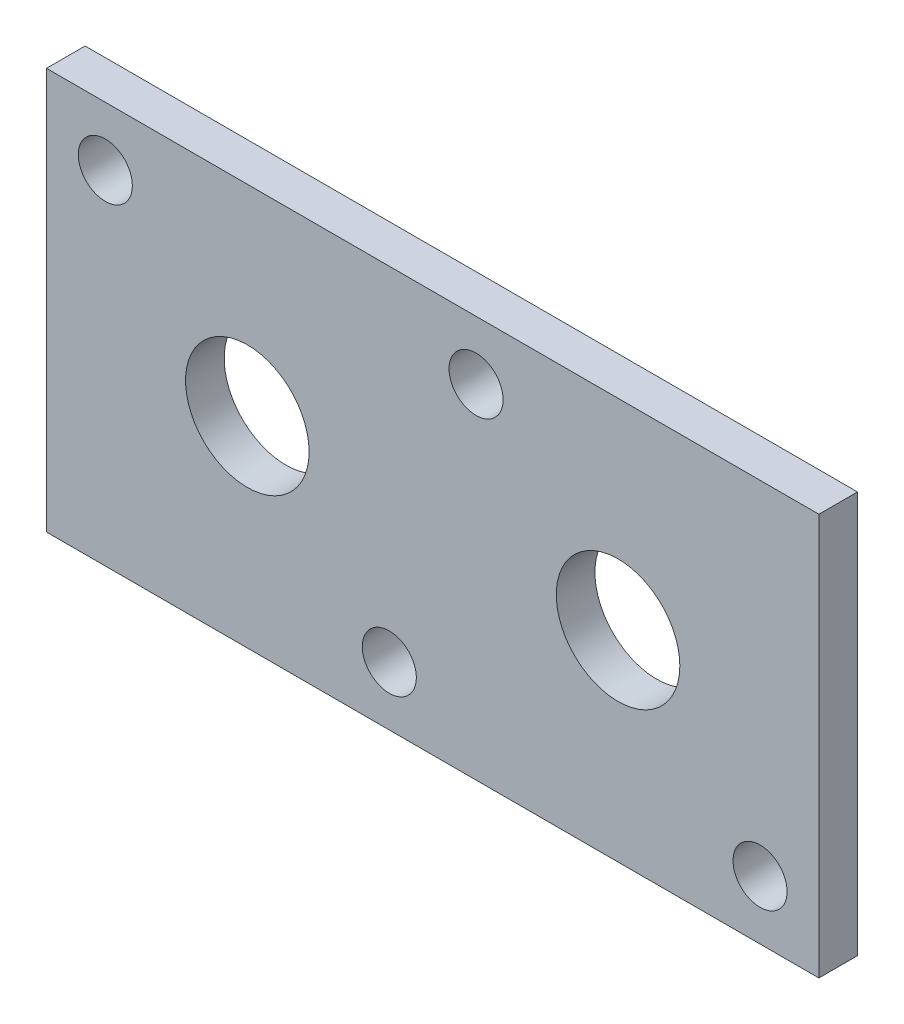
ISO-10303-21;
HEADER;
FILE_DESCRIPTION(('STEP AP214'),'2;1');
FILE_NAME('part.step','',(''),(''),'','','');
FILE_SCHEMA(('AUTOMOTIVE_DESIGN { 1 0 10303 214 1 1 1 1 }'));
ENDSEC;
DATA;
#1=APPLICATION_CONTEXT('core data for automotive mechanical design processes');
#2=APPLICATION_PROTOCOL_DEFINITION('international standard','automotive_design',2000,#1);
#3=PRODUCT_CONTEXT('',#1,'mechanical');
#4=PRODUCT('Part','Part','',(#3));
#5=PRODUCT_RELATED_PRODUCT_CATEGORY('part','',(#4));
#6=PRODUCT_DEFINITION_FORMATION('','',#4);
#7=PRODUCT_DEFINITION_CONTEXT('part definition',#1,'design');
#8=PRODUCT_DEFINITION('design','',#6,#7);
#9=PRODUCT_DEFINITION_SHAPE('','',#8);
#10=(LENGTH_UNIT() NAMED_UNIT(*) SI_UNIT(.MILLI.,.METRE.));
#11=(NAMED_UNIT(*) PLANE_ANGLE_UNIT() SI_UNIT($,.RADIAN.));
#12=(NAMED_UNIT(*) SI_UNIT($,.STERADIAN.) SOLID_ANGLE_UNIT());
#13=UNCERTAINTY_MEASURE_WITH_UNIT(LENGTH_MEASURE(1.E-05),#10,'distance_accuracy_value','');
#14=(GEOMETRIC_REPRESENTATION_CONTEXT(3) GLOBAL_UNCERTAINTY_ASSIGNED_CONTEXT((#13)) GLOBAL_UNIT_ASSIGNED_CONTEXT((#10,
#11,#12)) REPRESENTATION_CONTEXT('',''));
#15=CARTESIAN_POINT('',(0.,0.,0.));
#16=DIRECTION('',(0.,0.,1.));
#17=DIRECTION('',(1.,0.,0.));
#18=AXIS2_PLACEMENT_3D('',#15,#16,#17);
#19=CARTESIAN_POINT('',(0.,0.,5.));
#20=DIRECTION('',(0.,0.,1.));
#21=DIRECTION('',(1.,0.,0.));
#22=AXIS2_PLACEMENT_3D('',#19,#20,#21);
#23=PLANE('',#22);
#24=CARTESIAN_POINT('',(5.61522368914977,18.3847763108502,5.));
#25=DIRECTION('',(0.,0.,1.));
#26=DIRECTION('',(1.,0.,0.));
#27=AXIS2_PLACEMENT_3D('',#24,#25,#26);
#28=CIRCLE('',#27,3.5);
#29=CARTESIAN_POINT('',(9.11522368914976,18.3847763108502,5.));
#30=VERTEX_POINT('',#29);
#31=EDGE_CURVE('E158',#30,#30,#28,.T.);
#32=ORIENTED_EDGE('',*,*,#31,.F.);
#33=EDGE_LOOP('',(#32));
#34=FACE_BOUND('',#33,.T.);
#35=CARTESIAN_POINT('',(-42.3847763108503,18.3847763108502,5.));
#36=DIRECTION('',(0.,0.,1.));
#37=DIRECTION('',(1.,0.,0.));
#38=AXIS2_PLACEMENT_3D('',#35,#36,#37);
#39=CIRCLE('',#38,3.5);
#40=CARTESIAN_POINT('',(-38.8847763108503,18.3847763108502,5.));
#41=VERTEX_POINT('',#40);
#42=EDGE_CURVE('E142',#41,#41,#39,.T.);
#43=ORIENTED_EDGE('',*,*,#42,.F.);
#44=EDGE_LOOP('',(#43));
#45=FACE_BOUND('',#44,.T.);
#46=CARTESIAN_POINT('',(24.,0.,5.));
#47=DIRECTION('',(0.,0.,1.));
#48=DIRECTION('',(1.,0.,0.));
#49=AXIS2_PLACEMENT_3D('',#46,#47,#48);
#50=CIRCLE('',#49,8.);
#51=CARTESIAN_POINT('',(32.,0.,5.));
#52=VERTEX_POINT('',#51);
#53=EDGE_CURVE('E112',#52,#52,#50,.T.);
#54=ORIENTED_EDGE('',*,*,#53,.F.);
#55=EDGE_LOOP('',(#54));
#56=FACE_BOUND('',#55,.T.);
#57=DIRECTION('',(0.,1.,0.));
#58=VECTOR('',#57,1.);
#59=CARTESIAN_POINT('',(50.,26.,5.));
#60=LINE('',#59,#58);
#61=CARTESIAN_POINT('',(50.,-26.,5.));
#62=VERTEX_POINT('',#61);
#63=CARTESIAN_POINT('',(50.,26.,5.));
#64=VERTEX_POINT('',#63);
#65=EDGE_CURVE('E92',#62,#64,#60,.T.);
#66=ORIENTED_EDGE('',*,*,#65,.T.);
#67=DIRECTION('',(-1.,0.,0.));
#68=VECTOR('',#67,1.);
#69=CARTESIAN_POINT('',(-50.,26.,5.));
#70=LINE('',#69,#68);
#71=CARTESIAN_POINT('',(-50.,26.,5.));
#72=VERTEX_POINT('',#71);
#73=EDGE_CURVE('E87',#64,#72,#70,.T.);
#74=ORIENTED_EDGE('',*,*,#73,.T.);
#75=DIRECTION('',(0.,-1.,0.));
#76=VECTOR('',#75,1.);
#77=CARTESIAN_POINT('',(-50.,26.,5.));
#78=LINE('',#77,#76);
#79=CARTESIAN_POINT('',(-50.,-26.,5.));
#80=VERTEX_POINT('',#79);
#81=EDGE_CURVE('E90',#72,#80,#78,.T.);
#82=ORIENTED_EDGE('',*,*,#81,.T.);
#83=DIRECTION('',(1.,0.,0.));
#84=VECTOR('',#83,1.);
#85=CARTESIAN_POINT('',(-50.,-26.,5.));
#86=LINE('',#85,#84);
#87=EDGE_CURVE('E57',#80,#62,#86,.T.);
#88=ORIENTED_EDGE('',*,*,#87,.T.);
#89=EDGE_LOOP('',(#66,#74,#82,#88));
#90=FACE_BOUND('',#89,.T.);
#91=CARTESIAN_POINT('',(-24.,0.,5.));
#92=DIRECTION('',(0.,0.,1.));
#93=DIRECTION('',(1.,0.,0.));
#94=AXIS2_PLACEMENT_3D('',#91,#92,#93);
#95=CIRCLE('',#94,8.);
#96=CARTESIAN_POINT('',(-16.,0.,5.));
#97=VERTEX_POINT('',#96);
#98=EDGE_CURVE('E134',#97,#97,#95,.T.);
#99=ORIENTED_EDGE('',*,*,#98,.F.);
#100=EDGE_LOOP('',(#99));
#101=FACE_BOUND('',#100,.T.);
#102=CARTESIAN_POINT('',(-5.61522368914973,-18.3847763108502,5.));
#103=DIRECTION('',(0.,0.,1.));
#104=DIRECTION('',(1.,0.,0.));
#105=AXIS2_PLACEMENT_3D('',#102,#103,#104);
#106=CIRCLE('',#105,3.5);
#107=CARTESIAN_POINT('',(-2.11522368914973,-18.3847763108502,5.));
#108=VERTEX_POINT('',#107);
#109=EDGE_CURVE('E150',#108,#108,#106,.T.);
#110=ORIENTED_EDGE('',*,*,#109,.F.);
#111=EDGE_LOOP('',(#110));
#112=FACE_BOUND('',#111,.T.);
#113=CARTESIAN_POINT('',(42.3847763108502,-18.3847763108502,5.));
#114=DIRECTION('',(0.,0.,1.));
#115=DIRECTION('',(1.,0.,0.));
#116=AXIS2_PLACEMENT_3D('',#113,#114,#115);
#117=CIRCLE('',#116,3.5);
#118=CARTESIAN_POINT('',(45.8847763108502,-18.3847763108502,5.));
#119=VERTEX_POINT('',#118);
#120=EDGE_CURVE('E166',#119,#119,#117,.T.);
#121=ORIENTED_EDGE('',*,*,#120,.F.);
#122=EDGE_LOOP('',(#121));
#123=FACE_BOUND('',#122,.T.);
#124=ADVANCED_FACE('F39',(#34,#45,#56,#90,#101,#112,#123),#23,.T.);
#125=CARTESIAN_POINT('',(0.,0.,0.));
#126=DIRECTION('',(0.,0.,1.));
#127=DIRECTION('',(1.,0.,0.));
#128=AXIS2_PLACEMENT_3D('',#125,#126,#127);
#129=PLANE('',#128);
#130=DIRECTION('',(0.,1.,0.));
#131=VECTOR('',#130,1.);
#132=CARTESIAN_POINT('',(50.,26.,0.));
#133=LINE('',#132,#131);
#134=CARTESIAN_POINT('',(50.,-26.,0.));
#135=VERTEX_POINT('',#134);
#136=CARTESIAN_POINT('',(50.,26.,0.));
#137=VERTEX_POINT('',#136);
#138=EDGE_CURVE('E108',#135,#137,#133,.T.);
#139=ORIENTED_EDGE('',*,*,#138,.F.);
#140=DIRECTION('',(1.,0.,0.));
#141=VECTOR('',#140,1.);
#142=CARTESIAN_POINT('',(-50.,-26.,0.));
#143=LINE('',#142,#141);
#144=CARTESIAN_POINT('',(-50.,-26.,0.));
#145=VERTEX_POINT('',#144);
#146=EDGE_CURVE('E80',#145,#135,#143,.T.);
#147=ORIENTED_EDGE('',*,*,#146,.F.);
#148=DIRECTION('',(0.,-1.,0.));
#149=VECTOR('',#148,1.);
#150=CARTESIAN_POINT('',(-50.,26.,0.));
#151=LINE('',#150,#149);
#152=CARTESIAN_POINT('',(-50.,26.,0.));
#153=VERTEX_POINT('',#152);
#154=EDGE_CURVE('E74',#153,#145,#151,.T.);
#155=ORIENTED_EDGE('',*,*,#154,.F.);
#156=DIRECTION('',(-1.,0.,0.));
#157=VECTOR('',#156,1.);
#158=CARTESIAN_POINT('',(-50.,26.,0.));
#159=LINE('',#158,#157);
#160=EDGE_CURVE('E97',#137,#153,#159,.T.);
#161=ORIENTED_EDGE('',*,*,#160,.F.);
#162=EDGE_LOOP('',(#139,#147,#155,#161));
#163=FACE_BOUND('',#162,.T.);
#164=CARTESIAN_POINT('',(24.,0.,0.));
#165=DIRECTION('',(0.,0.,1.));
#166=DIRECTION('',(1.,0.,0.));
#167=AXIS2_PLACEMENT_3D('',#164,#165,#166);
#168=CIRCLE('',#167,8.);
#169=CARTESIAN_POINT('',(32.,0.,0.));
#170=VERTEX_POINT('',#169);
#171=EDGE_CURVE('E130',#170,#170,#168,.T.);
#172=ORIENTED_EDGE('',*,*,#171,.T.);
#173=EDGE_LOOP('',(#172));
#174=FACE_BOUND('',#173,.T.);
#175=CARTESIAN_POINT('',(-24.,0.,0.));
#176=DIRECTION('',(0.,0.,1.));
#177=DIRECTION('',(1.,0.,0.));
#178=AXIS2_PLACEMENT_3D('',#175,#176,#177);
#179=CIRCLE('',#178,8.);
#180=CARTESIAN_POINT('',(-16.,0.,0.));
#181=VERTEX_POINT('',#180);
#182=EDGE_CURVE('E138',#181,#181,#179,.T.);
#183=ORIENTED_EDGE('',*,*,#182,.T.);
#184=EDGE_LOOP('',(#183));
#185=FACE_BOUND('',#184,.T.);
#186=CARTESIAN_POINT('',(-42.3847763108503,18.3847763108502,0.));
#187=DIRECTION('',(0.,0.,1.));
#188=DIRECTION('',(1.,0.,0.));
#189=AXIS2_PLACEMENT_3D('',#186,#187,#188);
#190=CIRCLE('',#189,3.5);
#191=CARTESIAN_POINT('',(-38.8847763108503,18.3847763108502,0.));
#192=VERTEX_POINT('',#191);
#193=EDGE_CURVE('E146',#192,#192,#190,.T.);
#194=ORIENTED_EDGE('',*,*,#193,.T.);
#195=EDGE_LOOP('',(#194));
#196=FACE_BOUND('',#195,.T.);
#197=CARTESIAN_POINT('',(-5.61522368914973,-18.3847763108502,0.));
#198=DIRECTION('',(0.,0.,1.));
#199=DIRECTION('',(1.,0.,0.));
#200=AXIS2_PLACEMENT_3D('',#197,#198,#199);
#201=CIRCLE('',#200,3.5);
#202=CARTESIAN_POINT('',(-2.11522368914973,-18.3847763108502,0.));
#203=VERTEX_POINT('',#202);
#204=EDGE_CURVE('E154',#203,#203,#201,.T.);
#205=ORIENTED_EDGE('',*,*,#204,.T.);
#206=EDGE_LOOP('',(#205));
#207=FACE_BOUND('',#206,.T.);
#208=CARTESIAN_POINT('',(5.61522368914977,18.3847763108502,0.));
#209=DIRECTION('',(0.,0.,1.));
#210=DIRECTION('',(1.,0.,0.));
#211=AXIS2_PLACEMENT_3D('',#208,#209,#210);
#212=CIRCLE('',#211,3.5);
#213=CARTESIAN_POINT('',(9.11522368914976,18.3847763108502,0.));
#214=VERTEX_POINT('',#213);
#215=EDGE_CURVE('E162',#214,#214,#212,.T.);
#216=ORIENTED_EDGE('',*,*,#215,.T.);
#217=EDGE_LOOP('',(#216));
#218=FACE_BOUND('',#217,.T.);
#219=CARTESIAN_POINT('',(42.3847763108502,-18.3847763108502,0.));
#220=DIRECTION('',(0.,0.,1.));
#221=DIRECTION('',(1.,0.,0.));
#222=AXIS2_PLACEMENT_3D('',#219,#220,#221);
#223=CIRCLE('',#222,3.5);
#224=CARTESIAN_POINT('',(45.8847763108502,-18.3847763108502,0.));
#225=VERTEX_POINT('',#224);
#226=EDGE_CURVE('E170',#225,#225,#223,.T.);
#227=ORIENTED_EDGE('',*,*,#226,.T.);
#228=EDGE_LOOP('',(#227));
#229=FACE_BOUND('',#228,.T.);
#230=ADVANCED_FACE('F125',(#163,#174,#185,#196,#207,#218,#229),#129,.F.);
#231=CARTESIAN_POINT('',(50.,26.,5.));
#232=DIRECTION('',(-1.,0.,0.));
#233=DIRECTION('',(0.,-1.,0.));
#234=AXIS2_PLACEMENT_3D('',#231,#232,#233);
#235=PLANE('',#234);
#236=ORIENTED_EDGE('',*,*,#138,.T.);
#237=DIRECTION('',(0.,0.,-1.));
#238=VECTOR('',#237,1.);
#239=CARTESIAN_POINT('',(50.,26.,5.));
#240=LINE('',#239,#238);
#241=EDGE_CURVE('E11',#64,#137,#240,.T.);
#242=ORIENTED_EDGE('',*,*,#241,.F.);
#243=ORIENTED_EDGE('',*,*,#65,.F.);
#244=DIRECTION('',(0.,0.,-1.));
#245=VECTOR('',#244,1.);
#246=CARTESIAN_POINT('',(50.,-26.,5.));
#247=LINE('',#246,#245);
#248=EDGE_CURVE('E104',#62,#135,#247,.T.);
#249=ORIENTED_EDGE('',*,*,#248,.T.);
#250=EDGE_LOOP('',(#236,#242,#243,#249));
#251=FACE_BOUND('',#250,.T.);
#252=ADVANCED_FACE('F41',(#251),#235,.F.);
#253=CARTESIAN_POINT('',(-50.,26.,5.));
#254=DIRECTION('',(0.,-1.,0.));
#255=DIRECTION('',(0.,0.,-1.));
#256=AXIS2_PLACEMENT_3D('',#253,#254,#255);
#257=PLANE('',#256);
#258=ORIENTED_EDGE('',*,*,#160,.T.);
#259=DIRECTION('',(0.,0.,-1.));
#260=VECTOR('',#259,1.);
#261=CARTESIAN_POINT('',(-50.,26.,5.));
#262=LINE('',#261,#260);
#263=EDGE_CURVE('E49',#72,#153,#262,.T.);
#264=ORIENTED_EDGE('',*,*,#263,.F.);
#265=ORIENTED_EDGE('',*,*,#73,.F.);
#266=ORIENTED_EDGE('',*,*,#241,.T.);
#267=EDGE_LOOP('',(#258,#264,#265,#266));
#268=FACE_BOUND('',#267,.T.);
#269=ADVANCED_FACE('F96',(#268),#257,.F.);
#270=CARTESIAN_POINT('',(-50.,26.,5.));
#271=DIRECTION('',(1.,0.,0.));
#272=DIRECTION('',(0.,1.,0.));
#273=AXIS2_PLACEMENT_3D('',#270,#271,#272);
#274=PLANE('',#273);
#275=ORIENTED_EDGE('',*,*,#154,.T.);
#276=DIRECTION('',(0.,0.,-1.));
#277=VECTOR('',#276,1.);
#278=CARTESIAN_POINT('',(-50.,-26.,5.));
#279=LINE('',#278,#277);
#280=EDGE_CURVE('E99',#80,#145,#279,.T.);
#281=ORIENTED_EDGE('',*,*,#280,.F.);
#282=ORIENTED_EDGE('',*,*,#81,.F.);
#283=ORIENTED_EDGE('',*,*,#263,.T.);
#284=EDGE_LOOP('',(#275,#281,#282,#283));
#285=FACE_BOUND('',#284,.T.);
#286=ADVANCED_FACE('F100',(#285),#274,.F.);
#287=CARTESIAN_POINT('',(-50.,-26.,5.));
#288=DIRECTION('',(0.,1.,0.));
#289=DIRECTION('',(0.,0.,1.));
#290=AXIS2_PLACEMENT_3D('',#287,#288,#289);
#291=PLANE('',#290);
#292=ORIENTED_EDGE('',*,*,#146,.T.);
#293=ORIENTED_EDGE('',*,*,#248,.F.);
#294=ORIENTED_EDGE('',*,*,#87,.F.);
#295=ORIENTED_EDGE('',*,*,#280,.T.);
#296=EDGE_LOOP('',(#292,#293,#294,#295));
#297=FACE_BOUND('',#296,.T.);
#298=ADVANCED_FACE('F122',(#297),#291,.F.);
#299=CARTESIAN_POINT('',(24.,0.,5.));
#300=DIRECTION('',(0.,0.,-1.));
#301=DIRECTION('',(-1.,0.,0.));
#302=AXIS2_PLACEMENT_3D('',#299,#300,#301);
#303=CYLINDRICAL_SURFACE('',#302,8.);
#304=ORIENTED_EDGE('',*,*,#53,.T.);
#305=EDGE_LOOP('',(#304));
#306=FACE_BOUND('',#305,.T.);
#307=ORIENTED_EDGE('',*,*,#171,.F.);
#308=EDGE_LOOP('',(#307));
#309=FACE_BOUND('',#308,.T.);
#310=ADVANCED_FACE('F191',(#306,#309),#303,.F.);
#311=CARTESIAN_POINT('',(-24.,0.,5.));
#312=DIRECTION('',(0.,0.,-1.));
#313=DIRECTION('',(-1.,0.,0.));
#314=AXIS2_PLACEMENT_3D('',#311,#312,#313);
#315=CYLINDRICAL_SURFACE('',#314,8.);
#316=ORIENTED_EDGE('',*,*,#98,.T.);
#317=EDGE_LOOP('',(#316));
#318=FACE_BOUND('',#317,.T.);
#319=ORIENTED_EDGE('',*,*,#182,.F.);
#320=EDGE_LOOP('',(#319));
#321=FACE_BOUND('',#320,.T.);
#322=ADVANCED_FACE('F237',(#318,#321),#315,.F.);
#323=CARTESIAN_POINT('',(-42.3847763108503,18.3847763108502,5.));
#324=DIRECTION('',(0.,0.,-1.));
#325=DIRECTION('',(-1.,0.,0.));
#326=AXIS2_PLACEMENT_3D('',#323,#324,#325);
#327=CYLINDRICAL_SURFACE('',#326,3.5);
#328=ORIENTED_EDGE('',*,*,#42,.T.);
#329=EDGE_LOOP('',(#328));
#330=FACE_BOUND('',#329,.T.);
#331=ORIENTED_EDGE('',*,*,#193,.F.);
#332=EDGE_LOOP('',(#331));
#333=FACE_BOUND('',#332,.T.);
#334=ADVANCED_FACE('F245',(#330,#333),#327,.F.);
#335=CARTESIAN_POINT('',(-5.61522368914973,-18.3847763108502,5.));
#336=DIRECTION('',(0.,0.,-1.));
#337=DIRECTION('',(-1.,0.,0.));
#338=AXIS2_PLACEMENT_3D('',#335,#336,#337);
#339=CYLINDRICAL_SURFACE('',#338,3.5);
#340=ORIENTED_EDGE('',*,*,#109,.T.);
#341=EDGE_LOOP('',(#340));
#342=FACE_BOUND('',#341,.T.);
#343=ORIENTED_EDGE('',*,*,#204,.F.);
#344=EDGE_LOOP('',(#343));
#345=FACE_BOUND('',#344,.T.);
#346=ADVANCED_FACE('F253',(#342,#345),#339,.F.);
#347=CARTESIAN_POINT('',(5.61522368914977,18.3847763108502,5.));
#348=DIRECTION('',(0.,0.,-1.));
#349=DIRECTION('',(-1.,0.,0.));
#350=AXIS2_PLACEMENT_3D('',#347,#348,#349);
#351=CYLINDRICAL_SURFACE('',#350,3.5);
#352=ORIENTED_EDGE('',*,*,#31,.T.);
#353=EDGE_LOOP('',(#352));
#354=FACE_BOUND('',#353,.T.);
#355=ORIENTED_EDGE('',*,*,#215,.F.);
#356=EDGE_LOOP('',(#355));
#357=FACE_BOUND('',#356,.T.);
#358=ADVANCED_FACE('F262',(#354,#357),#351,.F.);
#359=CARTESIAN_POINT('',(42.3847763108502,-18.3847763108502,5.));
#360=DIRECTION('',(0.,0.,-1.));
#361=DIRECTION('',(-1.,0.,0.));
#362=AXIS2_PLACEMENT_3D('',#359,#360,#361);
#363=CYLINDRICAL_SURFACE('',#362,3.5);
#364=ORIENTED_EDGE('',*,*,#120,.T.);
#365=EDGE_LOOP('',(#364));
#366=FACE_BOUND('',#365,.T.);
#367=ORIENTED_EDGE('',*,*,#226,.F.);
#368=EDGE_LOOP('',(#367));
#369=FACE_BOUND('',#368,.T.);
#370=ADVANCED_FACE('F178',(#366,#369),#363,.F.);
#371=CLOSED_SHELL('',(#124,#230,#252,#269,#286,#298,#310,#322,#334,#346,#358,#370));
#372=MANIFOLD_SOLID_BREP('B2',#371);
#373=ADVANCED_BREP_SHAPE_REPRESENTATION('',(#18,#372),#14);
#374=SHAPE_DEFINITION_REPRESENTATION(#9,#373);
ENDSEC;
END-ISO-10303-21;
